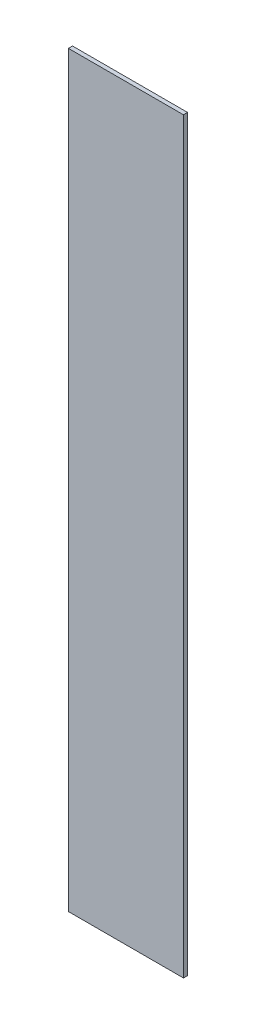
ISO-10303-21;
HEADER;
FILE_DESCRIPTION(('STEP AP214'),'2;1');
FILE_NAME('part.step','',(''),(''),'','','');
FILE_SCHEMA(('AUTOMOTIVE_DESIGN { 1 0 10303 214 1 1 1 1 }'));
ENDSEC;
DATA;
#1=APPLICATION_CONTEXT('core data for automotive mechanical design processes');
#2=APPLICATION_PROTOCOL_DEFINITION('international standard','automotive_design',2000,#1);
#3=PRODUCT_CONTEXT('',#1,'mechanical');
#4=PRODUCT('Part','Part','',(#3));
#5=PRODUCT_RELATED_PRODUCT_CATEGORY('part','',(#4));
#6=PRODUCT_DEFINITION_FORMATION('','',#4);
#7=PRODUCT_DEFINITION_CONTEXT('part definition',#1,'design');
#8=PRODUCT_DEFINITION('design','',#6,#7);
#9=PRODUCT_DEFINITION_SHAPE('','',#8);
#10=(LENGTH_UNIT() NAMED_UNIT(*) SI_UNIT(.MILLI.,.METRE.));
#11=(NAMED_UNIT(*) PLANE_ANGLE_UNIT() SI_UNIT($,.RADIAN.));
#12=(NAMED_UNIT(*) SI_UNIT($,.STERADIAN.) SOLID_ANGLE_UNIT());
#13=UNCERTAINTY_MEASURE_WITH_UNIT(LENGTH_MEASURE(1.E-05),#10,'distance_accuracy_value','');
#14=(GEOMETRIC_REPRESENTATION_CONTEXT(3) GLOBAL_UNCERTAINTY_ASSIGNED_CONTEXT((#13)) GLOBAL_UNIT_ASSIGNED_CONTEXT((#10,
#11,#12)) REPRESENTATION_CONTEXT('',''));
#15=CARTESIAN_POINT('',(0.,0.,0.));
#16=DIRECTION('',(0.,0.,1.));
#17=DIRECTION('',(1.,0.,0.));
#18=AXIS2_PLACEMENT_3D('',#15,#16,#17);
#19=CARTESIAN_POINT('',(623.,1724.,27.));
#20=DIRECTION('',(1.,0.,0.));
#21=DIRECTION('',(0.,0.,-1.));
#22=AXIS2_PLACEMENT_3D('',#19,#20,#21);
#23=PLANE('',#22);
#24=DIRECTION('',(0.,-1.,0.));
#25=VECTOR('',#24,1.);
#26=CARTESIAN_POINT('',(623.,1724.,26.));
#27=LINE('',#26,#25);
#28=CARTESIAN_POINT('',(623.,1906.,26.));
#29=VERTEX_POINT('',#28);
#30=CARTESIAN_POINT('',(623.,1724.,26.));
#31=VERTEX_POINT('',#30);
#32=EDGE_CURVE('E102',#29,#31,#27,.T.);
#33=ORIENTED_EDGE('',*,*,#32,.T.);
#34=DIRECTION('',(0.,0.,-1.));
#35=VECTOR('',#34,1.);
#36=CARTESIAN_POINT('',(623.,1724.,27.));
#37=LINE('',#36,#35);
#38=CARTESIAN_POINT('',(623.,1724.,27.));
#39=VERTEX_POINT('',#38);
#40=EDGE_CURVE('E11',#39,#31,#37,.T.);
#41=ORIENTED_EDGE('',*,*,#40,.F.);
#42=DIRECTION('',(0.,-1.,0.));
#43=VECTOR('',#42,1.);
#44=CARTESIAN_POINT('',(623.,1724.,27.));
#45=LINE('',#44,#43);
#46=CARTESIAN_POINT('',(623.,1906.,27.));
#47=VERTEX_POINT('',#46);
#48=EDGE_CURVE('E90',#47,#39,#45,.T.);
#49=ORIENTED_EDGE('',*,*,#48,.F.);
#50=DIRECTION('',(0.,0.,-1.));
#51=VECTOR('',#50,1.);
#52=CARTESIAN_POINT('',(623.,1906.,27.));
#53=LINE('',#52,#51);
#54=EDGE_CURVE('E98',#47,#29,#53,.T.);
#55=ORIENTED_EDGE('',*,*,#54,.T.);
#56=EDGE_LOOP('',(#33,#41,#49,#55));
#57=FACE_BOUND('',#56,.T.);
#58=ADVANCED_FACE('F39',(#57),#23,.F.);
#59=CARTESIAN_POINT('',(623.,1724.,27.));
#60=DIRECTION('',(0.,1.,0.));
#61=DIRECTION('',(0.,0.,1.));
#62=AXIS2_PLACEMENT_3D('',#59,#60,#61);
#63=PLANE('',#62);
#64=DIRECTION('',(1.,0.,0.));
#65=VECTOR('',#64,1.);
#66=CARTESIAN_POINT('',(623.,1724.,26.));
#67=LINE('',#66,#65);
#68=CARTESIAN_POINT('',(651.,1724.,26.));
#69=VERTEX_POINT('',#68);
#70=EDGE_CURVE('E94',#31,#69,#67,.T.);
#71=ORIENTED_EDGE('',*,*,#70,.T.);
#72=DIRECTION('',(0.,0.,-1.));
#73=VECTOR('',#72,1.);
#74=CARTESIAN_POINT('',(651.,1724.,27.));
#75=LINE('',#74,#73);
#76=CARTESIAN_POINT('',(651.,1724.,27.));
#77=VERTEX_POINT('',#76);
#78=EDGE_CURVE('E47',#77,#69,#75,.T.);
#79=ORIENTED_EDGE('',*,*,#78,.F.);
#80=DIRECTION('',(1.,0.,0.));
#81=VECTOR('',#80,1.);
#82=CARTESIAN_POINT('',(623.,1724.,27.));
#83=LINE('',#82,#81);
#84=EDGE_CURVE('E85',#39,#77,#83,.T.);
#85=ORIENTED_EDGE('',*,*,#84,.F.);
#86=ORIENTED_EDGE('',*,*,#40,.T.);
#87=EDGE_LOOP('',(#71,#79,#85,#86));
#88=FACE_BOUND('',#87,.T.);
#89=ADVANCED_FACE('F93',(#88),#63,.F.);
#90=CARTESIAN_POINT('',(651.,1724.,27.));
#91=DIRECTION('',(-1.,0.,0.));
#92=DIRECTION('',(0.,0.,1.));
#93=AXIS2_PLACEMENT_3D('',#90,#91,#92);
#94=PLANE('',#93);
#95=DIRECTION('',(0.,1.,0.));
#96=VECTOR('',#95,1.);
#97=CARTESIAN_POINT('',(651.,1724.,26.));
#98=LINE('',#97,#96);
#99=CARTESIAN_POINT('',(651.,1906.,26.));
#100=VERTEX_POINT('',#99);
#101=EDGE_CURVE('E72',#69,#100,#98,.T.);
#102=ORIENTED_EDGE('',*,*,#101,.T.);
#103=DIRECTION('',(0.,0.,-1.));
#104=VECTOR('',#103,1.);
#105=CARTESIAN_POINT('',(651.,1906.,27.));
#106=LINE('',#105,#104);
#107=CARTESIAN_POINT('',(651.,1906.,27.));
#108=VERTEX_POINT('',#107);
#109=EDGE_CURVE('E95',#108,#100,#106,.T.);
#110=ORIENTED_EDGE('',*,*,#109,.F.);
#111=DIRECTION('',(0.,1.,0.));
#112=VECTOR('',#111,1.);
#113=CARTESIAN_POINT('',(651.,1724.,27.));
#114=LINE('',#113,#112);
#115=EDGE_CURVE('E88',#77,#108,#114,.T.);
#116=ORIENTED_EDGE('',*,*,#115,.F.);
#117=ORIENTED_EDGE('',*,*,#78,.T.);
#118=EDGE_LOOP('',(#102,#110,#116,#117));
#119=FACE_BOUND('',#118,.T.);
#120=ADVANCED_FACE('F96',(#119),#94,.F.);
#121=CARTESIAN_POINT('',(623.,1906.,27.));
#122=DIRECTION('',(0.,-1.,0.));
#123=DIRECTION('',(0.,0.,-1.));
#124=AXIS2_PLACEMENT_3D('',#121,#122,#123);
#125=PLANE('',#124);
#126=DIRECTION('',(-1.,0.,0.));
#127=VECTOR('',#126,1.);
#128=CARTESIAN_POINT('',(623.,1906.,26.));
#129=LINE('',#128,#127);
#130=EDGE_CURVE('E78',#100,#29,#129,.T.);
#131=ORIENTED_EDGE('',*,*,#130,.T.);
#132=ORIENTED_EDGE('',*,*,#54,.F.);
#133=DIRECTION('',(-1.,0.,0.));
#134=VECTOR('',#133,1.);
#135=CARTESIAN_POINT('',(623.,1906.,27.));
#136=LINE('',#135,#134);
#137=EDGE_CURVE('E55',#108,#47,#136,.T.);
#138=ORIENTED_EDGE('',*,*,#137,.F.);
#139=ORIENTED_EDGE('',*,*,#109,.T.);
#140=EDGE_LOOP('',(#131,#132,#138,#139));
#141=FACE_BOUND('',#140,.T.);
#142=ADVANCED_FACE('F109',(#141),#125,.F.);
#143=CARTESIAN_POINT('',(0.,0.,27.));
#144=DIRECTION('',(0.,0.,-1.));
#145=DIRECTION('',(-1.,0.,0.));
#146=AXIS2_PLACEMENT_3D('',#143,#144,#145);
#147=PLANE('',#146);
#148=ORIENTED_EDGE('',*,*,#48,.T.);
#149=ORIENTED_EDGE('',*,*,#84,.T.);
#150=ORIENTED_EDGE('',*,*,#115,.T.);
#151=ORIENTED_EDGE('',*,*,#137,.T.);
#152=EDGE_LOOP('',(#148,#149,#150,#151));
#153=FACE_BOUND('',#152,.T.);
#154=ADVANCED_FACE('F86',(#153),#147,.F.);
#155=CARTESIAN_POINT('',(0.,0.,26.));
#156=DIRECTION('',(0.,0.,-1.));
#157=DIRECTION('',(-1.,0.,0.));
#158=AXIS2_PLACEMENT_3D('',#155,#156,#157);
#159=PLANE('',#158);
#160=ORIENTED_EDGE('',*,*,#32,.F.);
#161=ORIENTED_EDGE('',*,*,#130,.F.);
#162=ORIENTED_EDGE('',*,*,#101,.F.);
#163=ORIENTED_EDGE('',*,*,#70,.F.);
#164=EDGE_LOOP('',(#160,#161,#162,#163));
#165=FACE_BOUND('',#164,.T.);
#166=ADVANCED_FACE('F112',(#165),#159,.T.);
#167=CLOSED_SHELL('',(#58,#89,#120,#142,#154,#166));
#168=MANIFOLD_SOLID_BREP('B2',#167);
#169=ADVANCED_BREP_SHAPE_REPRESENTATION('',(#18,#168),#14);
#170=SHAPE_DEFINITION_REPRESENTATION(#9,#169);
ENDSEC;
END-ISO-10303-21;
